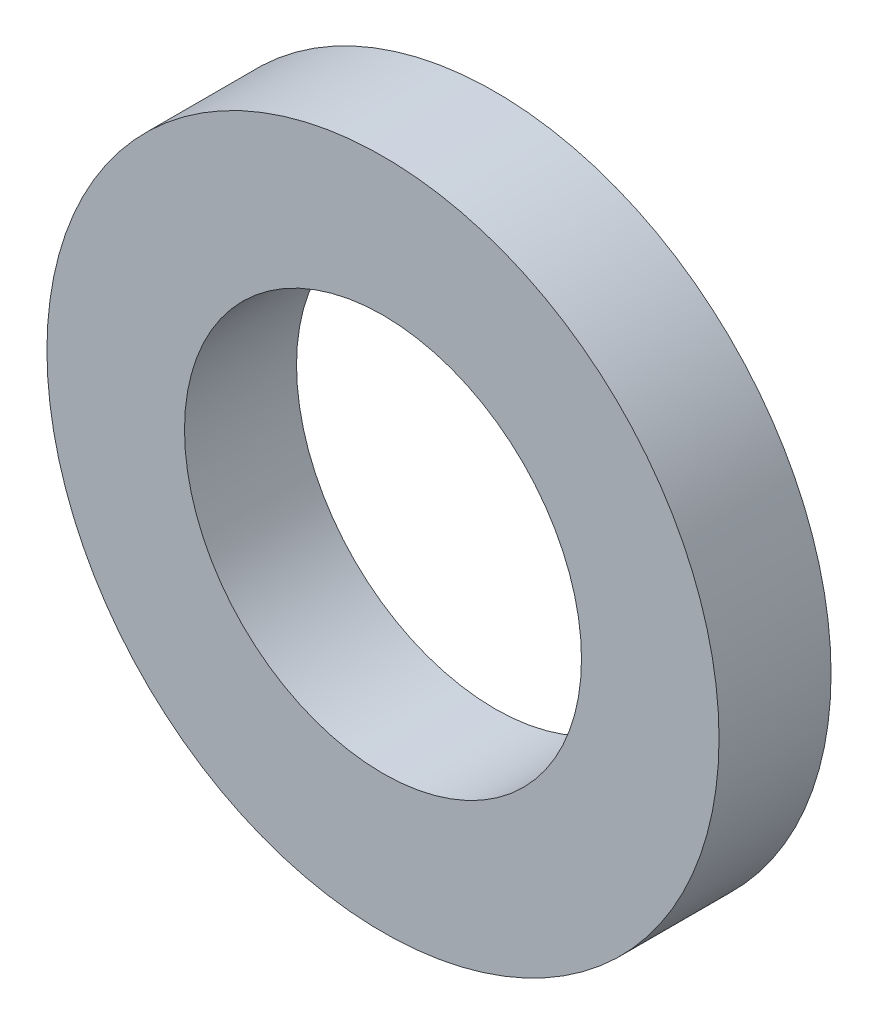
ISO-10303-21;
HEADER;
FILE_DESCRIPTION(('STEP AP214'),'2;1');
FILE_NAME('part.step','',(''),(''),'','','');
FILE_SCHEMA(('AUTOMOTIVE_DESIGN { 1 0 10303 214 1 1 1 1 }'));
ENDSEC;
DATA;
#1=APPLICATION_CONTEXT('core data for automotive mechanical design processes');
#2=APPLICATION_PROTOCOL_DEFINITION('international standard','automotive_design',2000,#1);
#3=PRODUCT_CONTEXT('',#1,'mechanical');
#4=PRODUCT('Part','Part','',(#3));
#5=PRODUCT_RELATED_PRODUCT_CATEGORY('part','',(#4));
#6=PRODUCT_DEFINITION_FORMATION('','',#4);
#7=PRODUCT_DEFINITION_CONTEXT('part definition',#1,'design');
#8=PRODUCT_DEFINITION('design','',#6,#7);
#9=PRODUCT_DEFINITION_SHAPE('','',#8);
#10=(LENGTH_UNIT() NAMED_UNIT(*) SI_UNIT(.MILLI.,.METRE.));
#11=(NAMED_UNIT(*) PLANE_ANGLE_UNIT() SI_UNIT($,.RADIAN.));
#12=(NAMED_UNIT(*) SI_UNIT($,.STERADIAN.) SOLID_ANGLE_UNIT());
#13=UNCERTAINTY_MEASURE_WITH_UNIT(LENGTH_MEASURE(1.E-05),#10,'distance_accuracy_value','');
#14=(GEOMETRIC_REPRESENTATION_CONTEXT(3) GLOBAL_UNCERTAINTY_ASSIGNED_CONTEXT((#13)) GLOBAL_UNIT_ASSIGNED_CONTEXT((#10,
#11,#12)) REPRESENTATION_CONTEXT('',''));
#15=CARTESIAN_POINT('',(0.,0.,0.));
#16=DIRECTION('',(0.,0.,1.));
#17=DIRECTION('',(1.,0.,0.));
#18=AXIS2_PLACEMENT_3D('',#15,#16,#17);
#19=CARTESIAN_POINT('',(0.,0.,0.));
#20=DIRECTION('',(0.,0.,1.));
#21=DIRECTION('',(1.,0.,0.));
#22=AXIS2_PLACEMENT_3D('',#19,#20,#21);
#23=PLANE('',#22);
#24=CARTESIAN_POINT('',(0.,0.,0.));
#25=DIRECTION('',(0.,0.,-1.));
#26=DIRECTION('',(-1.,0.,0.));
#27=AXIS2_PLACEMENT_3D('',#24,#25,#26);
#28=CIRCLE('',#27,5.6261);
#29=CARTESIAN_POINT('',(-5.6261,0.,0.));
#30=VERTEX_POINT('',#29);
#31=EDGE_CURVE('E27',#30,#30,#28,.F.);
#32=ORIENTED_EDGE('',*,*,#31,.T.);
#33=EDGE_LOOP('',(#32));
#34=FACE_BOUND('',#33,.T.);
#35=CARTESIAN_POINT('',(0.,0.,0.));
#36=DIRECTION('',(0.,0.,-1.));
#37=DIRECTION('',(-1.,0.,0.));
#38=AXIS2_PLACEMENT_3D('',#35,#36,#37);
#39=CIRCLE('',#38,9.525);
#40=CARTESIAN_POINT('',(-9.525,0.,0.));
#41=VERTEX_POINT('',#40);
#42=EDGE_CURVE('E18',#41,#41,#39,.F.);
#43=ORIENTED_EDGE('',*,*,#42,.F.);
#44=EDGE_LOOP('',(#43));
#45=FACE_BOUND('',#44,.T.);
#46=ADVANCED_FACE('F15',(#34,#45),#23,.F.);
#47=CARTESIAN_POINT('',(0.,0.,3.175));
#48=DIRECTION('',(0.,0.,-1.));
#49=DIRECTION('',(-1.,0.,0.));
#50=AXIS2_PLACEMENT_3D('',#47,#48,#49);
#51=CYLINDRICAL_SURFACE('',#50,9.525);
#52=ORIENTED_EDGE('',*,*,#42,.T.);
#53=EDGE_LOOP('',(#52));
#54=FACE_BOUND('',#53,.T.);
#55=CARTESIAN_POINT('',(0.,0.,3.175));
#56=DIRECTION('',(0.,0.,-1.));
#57=DIRECTION('',(-1.,0.,0.));
#58=AXIS2_PLACEMENT_3D('',#55,#56,#57);
#59=CIRCLE('',#58,9.525);
#60=CARTESIAN_POINT('',(-9.525,0.,3.175));
#61=VERTEX_POINT('',#60);
#62=EDGE_CURVE('E22',#61,#61,#59,.F.);
#63=ORIENTED_EDGE('',*,*,#62,.F.);
#64=EDGE_LOOP('',(#63));
#65=FACE_BOUND('',#64,.T.);
#66=ADVANCED_FACE('F35',(#54,#65),#51,.T.);
#67=CARTESIAN_POINT('',(0.,0.,3.175));
#68=DIRECTION('',(0.,0.,-1.));
#69=DIRECTION('',(-1.,0.,0.));
#70=AXIS2_PLACEMENT_3D('',#67,#68,#69);
#71=CYLINDRICAL_SURFACE('',#70,5.6261);
#72=CARTESIAN_POINT('',(0.,0.,3.175));
#73=DIRECTION('',(0.,0.,-1.));
#74=DIRECTION('',(-1.,0.,0.));
#75=AXIS2_PLACEMENT_3D('',#72,#73,#74);
#76=CIRCLE('',#75,5.6261);
#77=CARTESIAN_POINT('',(-5.6261,0.,3.175));
#78=VERTEX_POINT('',#77);
#79=EDGE_CURVE('E10',#78,#78,#76,.T.);
#80=ORIENTED_EDGE('',*,*,#79,.F.);
#81=EDGE_LOOP('',(#80));
#82=FACE_BOUND('',#81,.T.);
#83=ORIENTED_EDGE('',*,*,#31,.F.);
#84=EDGE_LOOP('',(#83));
#85=FACE_BOUND('',#84,.T.);
#86=ADVANCED_FACE('F43',(#82,#85),#71,.F.);
#87=CARTESIAN_POINT('',(0.,0.,3.175));
#88=DIRECTION('',(0.,0.,1.));
#89=DIRECTION('',(1.,0.,0.));
#90=AXIS2_PLACEMENT_3D('',#87,#88,#89);
#91=PLANE('',#90);
#92=ORIENTED_EDGE('',*,*,#79,.T.);
#93=EDGE_LOOP('',(#92));
#94=FACE_BOUND('',#93,.T.);
#95=ORIENTED_EDGE('',*,*,#62,.T.);
#96=EDGE_LOOP('',(#95));
#97=FACE_BOUND('',#96,.T.);
#98=ADVANCED_FACE('F44',(#94,#97),#91,.T.);
#99=CLOSED_SHELL('',(#46,#66,#86,#98));
#100=MANIFOLD_SOLID_BREP('B1',#99);
#101=ADVANCED_BREP_SHAPE_REPRESENTATION('',(#18,#100),#14);
#102=SHAPE_DEFINITION_REPRESENTATION(#9,#101);
ENDSEC;
END-ISO-10303-21;
